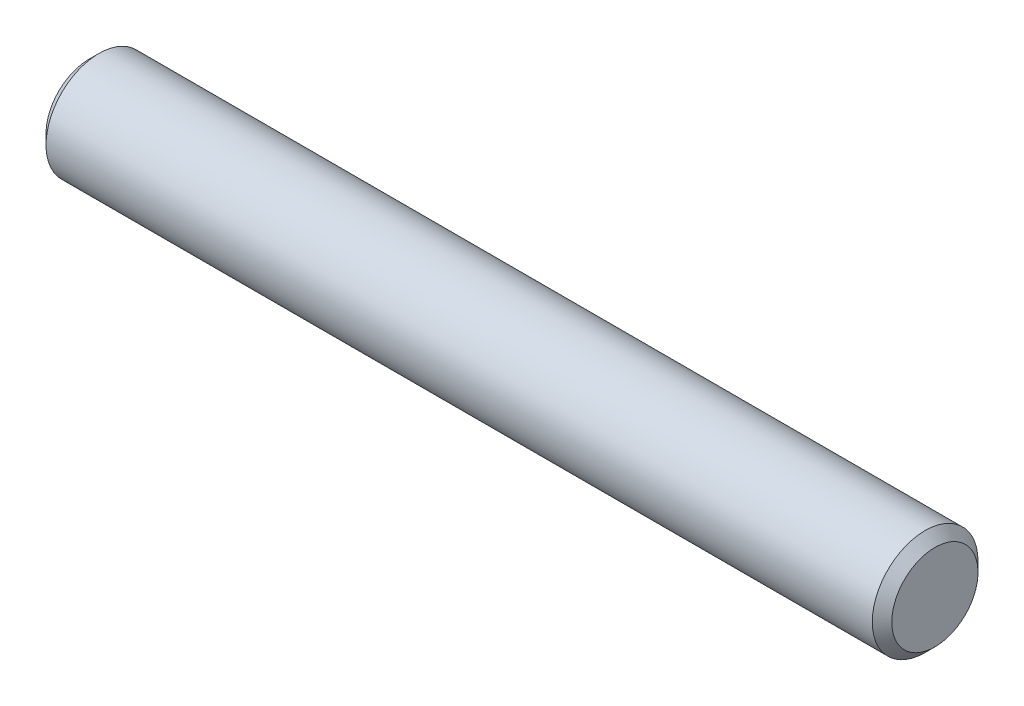
ISO-10303-21;
HEADER;
FILE_DESCRIPTION(('STEP AP214'),'2;1');
FILE_NAME('part.step','',(''),(''),'','','');
FILE_SCHEMA(('AUTOMOTIVE_DESIGN { 1 0 10303 214 1 1 1 1 }'));
ENDSEC;
DATA;
#1=APPLICATION_CONTEXT('core data for automotive mechanical design processes');
#2=APPLICATION_PROTOCOL_DEFINITION('international standard','automotive_design',2000,#1);
#3=PRODUCT_CONTEXT('',#1,'mechanical');
#4=PRODUCT('Part','Part','',(#3));
#5=PRODUCT_RELATED_PRODUCT_CATEGORY('part','',(#4));
#6=PRODUCT_DEFINITION_FORMATION('','',#4);
#7=PRODUCT_DEFINITION_CONTEXT('part definition',#1,'design');
#8=PRODUCT_DEFINITION('design','',#6,#7);
#9=PRODUCT_DEFINITION_SHAPE('','',#8);
#10=(LENGTH_UNIT() NAMED_UNIT(*) SI_UNIT(.MILLI.,.METRE.));
#11=(NAMED_UNIT(*) PLANE_ANGLE_UNIT() SI_UNIT($,.RADIAN.));
#12=(NAMED_UNIT(*) SI_UNIT($,.STERADIAN.) SOLID_ANGLE_UNIT());
#13=UNCERTAINTY_MEASURE_WITH_UNIT(LENGTH_MEASURE(1.E-05),#10,'distance_accuracy_value','');
#14=(GEOMETRIC_REPRESENTATION_CONTEXT(3) GLOBAL_UNCERTAINTY_ASSIGNED_CONTEXT((#13)) GLOBAL_UNIT_ASSIGNED_CONTEXT((#10,
#11,#12)) REPRESENTATION_CONTEXT('',''));
#15=CARTESIAN_POINT('',(0.,0.,0.));
#16=DIRECTION('',(0.,0.,1.));
#17=DIRECTION('',(1.,0.,0.));
#18=AXIS2_PLACEMENT_3D('',#15,#16,#17);
#19=CARTESIAN_POINT('',(24.,0.,0.));
#20=DIRECTION('',(1.,0.,0.));
#21=DIRECTION('',(0.,0.,-1.));
#22=AXIS2_PLACEMENT_3D('',#19,#20,#21);
#23=CYLINDRICAL_SURFACE('',#22,3.00000000000002);
#24=CARTESIAN_POINT('',(23.4455,0.,0.));
#25=DIRECTION('',(-1.,0.,0.));
#26=DIRECTION('',(0.,0.,1.));
#27=AXIS2_PLACEMENT_3D('',#24,#25,#26);
#28=CIRCLE('',#27,3.);
#29=CARTESIAN_POINT('',(23.4455,0.,3.));
#30=VERTEX_POINT('',#29);
#31=EDGE_CURVE('E52',#30,#30,#28,.T.);
#32=ORIENTED_EDGE('',*,*,#31,.T.);
#33=EDGE_LOOP('',(#32));
#34=FACE_BOUND('',#33,.T.);
#35=CARTESIAN_POINT('',(-23.4455,0.,0.));
#36=DIRECTION('',(1.,0.,0.));
#37=DIRECTION('',(0.,0.,-1.));
#38=AXIS2_PLACEMENT_3D('',#35,#36,#37);
#39=CIRCLE('',#38,3.);
#40=CARTESIAN_POINT('',(-23.4455,0.,-3.));
#41=VERTEX_POINT('',#40);
#42=EDGE_CURVE('E10',#41,#41,#39,.T.);
#43=ORIENTED_EDGE('',*,*,#42,.T.);
#44=EDGE_LOOP('',(#43));
#45=FACE_BOUND('',#44,.T.);
#46=ADVANCED_FACE('F41',(#34,#45),#23,.T.);
#47=CARTESIAN_POINT('',(-24.,0.,0.));
#48=DIRECTION('',(1.,0.,0.));
#49=DIRECTION('',(0.,0.,-1.));
#50=AXIS2_PLACEMENT_3D('',#47,#48,#49);
#51=CONICAL_SURFACE('',#50,2.4455,0.785398163397464);
#52=ORIENTED_EDGE('',*,*,#42,.F.);
#53=EDGE_LOOP('',(#52));
#54=FACE_BOUND('',#53,.T.);
#55=CARTESIAN_POINT('',(-24.,0.,0.));
#56=DIRECTION('',(1.,0.,0.));
#57=DIRECTION('',(0.,0.,-1.));
#58=AXIS2_PLACEMENT_3D('',#55,#56,#57);
#59=CIRCLE('',#58,2.4455);
#60=CARTESIAN_POINT('',(-24.,0.,-2.4455));
#61=VERTEX_POINT('',#60);
#62=EDGE_CURVE('E48',#61,#61,#59,.T.);
#63=ORIENTED_EDGE('',*,*,#62,.T.);
#64=EDGE_LOOP('',(#63));
#65=FACE_BOUND('',#64,.T.);
#66=ADVANCED_FACE('F73',(#54,#65),#51,.T.);
#67=CARTESIAN_POINT('',(-24.,0.,3.00000000000002));
#68=DIRECTION('',(1.,0.,0.));
#69=DIRECTION('',(0.,0.,-1.));
#70=AXIS2_PLACEMENT_3D('',#67,#68,#69);
#71=PLANE('',#70);
#72=ORIENTED_EDGE('',*,*,#62,.F.);
#73=EDGE_LOOP('',(#72));
#74=FACE_BOUND('',#73,.T.);
#75=ADVANCED_FACE('F69',(#74),#71,.F.);
#76=CARTESIAN_POINT('',(24.,0.,0.));
#77=DIRECTION('',(-1.,0.,0.));
#78=DIRECTION('',(0.,0.,1.));
#79=AXIS2_PLACEMENT_3D('',#76,#77,#78);
#80=CONICAL_SURFACE('',#79,2.4455,0.785398163397464);
#81=ORIENTED_EDGE('',*,*,#31,.F.);
#82=EDGE_LOOP('',(#81));
#83=FACE_BOUND('',#82,.T.);
#84=CARTESIAN_POINT('',(24.,0.,0.));
#85=DIRECTION('',(-1.,0.,0.));
#86=DIRECTION('',(0.,0.,1.));
#87=AXIS2_PLACEMENT_3D('',#84,#85,#86);
#88=CIRCLE('',#87,2.4455);
#89=CARTESIAN_POINT('',(24.,0.,2.4455));
#90=VERTEX_POINT('',#89);
#91=EDGE_CURVE('E56',#90,#90,#88,.T.);
#92=ORIENTED_EDGE('',*,*,#91,.T.);
#93=EDGE_LOOP('',(#92));
#94=FACE_BOUND('',#93,.T.);
#95=ADVANCED_FACE('F62',(#83,#94),#80,.T.);
#96=CARTESIAN_POINT('',(24.,0.,0.));
#97=DIRECTION('',(-1.,0.,0.));
#98=DIRECTION('',(0.,0.,1.));
#99=AXIS2_PLACEMENT_3D('',#96,#97,#98);
#100=PLANE('',#99);
#101=ORIENTED_EDGE('',*,*,#91,.F.);
#102=EDGE_LOOP('',(#101));
#103=FACE_BOUND('',#102,.T.);
#104=ADVANCED_FACE('F43',(#103),#100,.F.);
#105=CLOSED_SHELL('',(#46,#66,#75,#95,#104));
#106=MANIFOLD_SOLID_BREP('B2',#105);
#107=ADVANCED_BREP_SHAPE_REPRESENTATION('',(#18,#106),#14);
#108=SHAPE_DEFINITION_REPRESENTATION(#9,#107);
ENDSEC;
END-ISO-10303-21;
